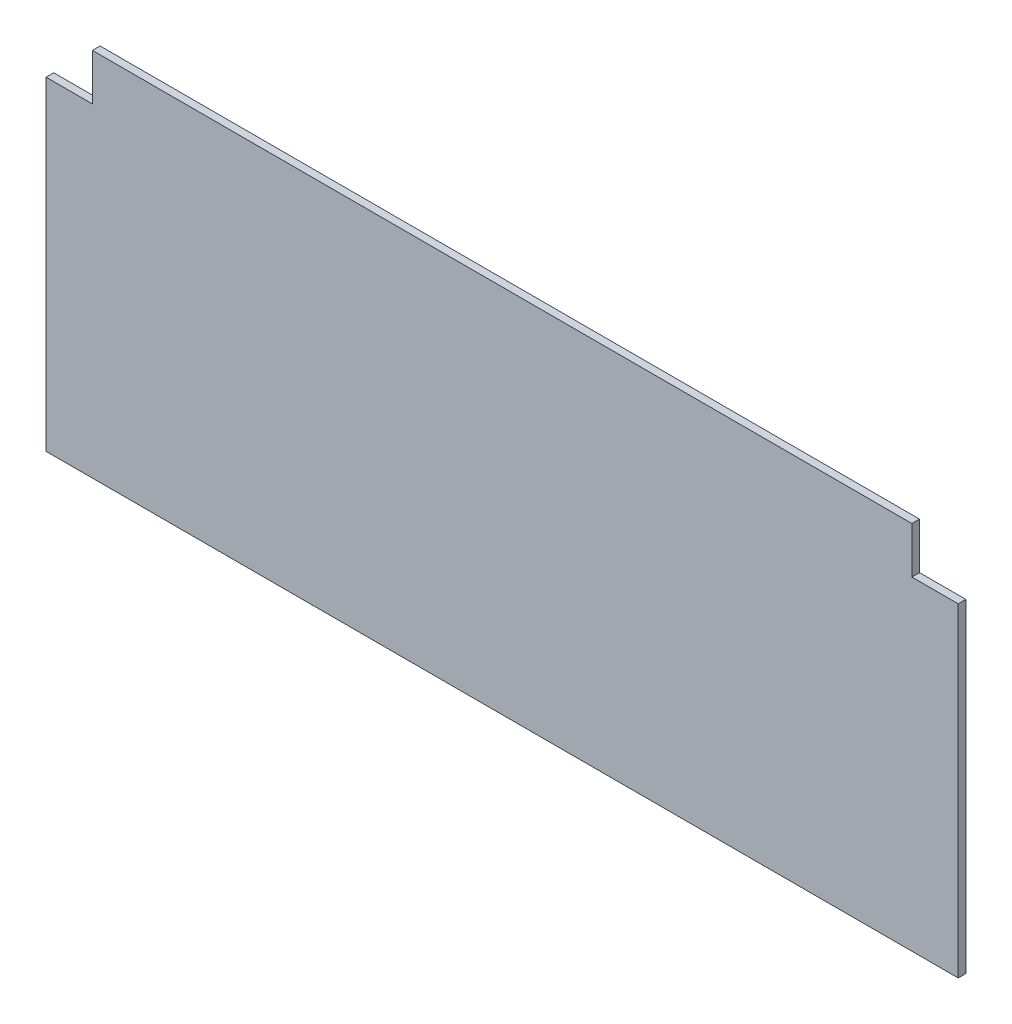
ISO-10303-21;
HEADER;
FILE_DESCRIPTION(('STEP AP214'),'2;1');
FILE_NAME('part.step','',(''),(''),'','','');
FILE_SCHEMA(('AUTOMOTIVE_DESIGN { 1 0 10303 214 1 1 1 1 }'));
ENDSEC;
DATA;
#1=APPLICATION_CONTEXT('core data for automotive mechanical design processes');
#2=APPLICATION_PROTOCOL_DEFINITION('international standard','automotive_design',2000,#1);
#3=PRODUCT_CONTEXT('',#1,'mechanical');
#4=PRODUCT('Part','Part','',(#3));
#5=PRODUCT_RELATED_PRODUCT_CATEGORY('part','',(#4));
#6=PRODUCT_DEFINITION_FORMATION('','',#4);
#7=PRODUCT_DEFINITION_CONTEXT('part definition',#1,'design');
#8=PRODUCT_DEFINITION('design','',#6,#7);
#9=PRODUCT_DEFINITION_SHAPE('','',#8);
#10=(LENGTH_UNIT() NAMED_UNIT(*) SI_UNIT(.MILLI.,.METRE.));
#11=(NAMED_UNIT(*) PLANE_ANGLE_UNIT() SI_UNIT($,.RADIAN.));
#12=(NAMED_UNIT(*) SI_UNIT($,.STERADIAN.) SOLID_ANGLE_UNIT());
#13=UNCERTAINTY_MEASURE_WITH_UNIT(LENGTH_MEASURE(1.E-05),#10,'distance_accuracy_value','');
#14=(GEOMETRIC_REPRESENTATION_CONTEXT(3) GLOBAL_UNCERTAINTY_ASSIGNED_CONTEXT((#13)) GLOBAL_UNIT_ASSIGNED_CONTEXT((#10,
#11,#12)) REPRESENTATION_CONTEXT('',''));
#15=CARTESIAN_POINT('',(0.,0.,0.));
#16=DIRECTION('',(0.,0.,1.));
#17=DIRECTION('',(1.,0.,0.));
#18=AXIS2_PLACEMENT_3D('',#15,#16,#17);
#19=CARTESIAN_POINT('',(0.,-39.8042937465679,-3.3));
#20=DIRECTION('',(0.,-1.,0.));
#21=DIRECTION('',(0.,0.,-1.));
#22=AXIS2_PLACEMENT_3D('',#19,#20,#21);
#23=PLANE('',#22);
#24=DIRECTION('',(1.,0.,0.));
#25=VECTOR('',#24,1.);
#26=CARTESIAN_POINT('',(0.,-39.8042937465679,0.));
#27=LINE('',#26,#25);
#28=CARTESIAN_POINT('',(0.,-39.8042937465679,0.));
#29=VERTEX_POINT('',#28);
#30=CARTESIAN_POINT('',(20.,-39.8042937465679,0.));
#31=VERTEX_POINT('',#30);
#32=EDGE_CURVE('E134',#29,#31,#27,.T.);
#33=ORIENTED_EDGE('',*,*,#32,.T.);
#34=DIRECTION('',(0.,0.,1.));
#35=VECTOR('',#34,1.);
#36=CARTESIAN_POINT('',(20.,-39.8042937465679,-3.3));
#37=LINE('',#36,#35);
#38=CARTESIAN_POINT('',(20.,-39.8042937465679,-3.3));
#39=VERTEX_POINT('',#38);
#40=EDGE_CURVE('E11',#39,#31,#37,.T.);
#41=ORIENTED_EDGE('',*,*,#40,.F.);
#42=DIRECTION('',(1.,0.,0.));
#43=VECTOR('',#42,1.);
#44=CARTESIAN_POINT('',(0.,-39.8042937465679,-3.3));
#45=LINE('',#44,#43);
#46=CARTESIAN_POINT('',(0.,-39.8042937465679,-3.3));
#47=VERTEX_POINT('',#46);
#48=EDGE_CURVE('E152',#47,#39,#45,.T.);
#49=ORIENTED_EDGE('',*,*,#48,.F.);
#50=DIRECTION('',(0.,0.,1.));
#51=VECTOR('',#50,1.);
#52=CARTESIAN_POINT('',(0.,-39.8042937465679,-3.3));
#53=LINE('',#52,#51);
#54=EDGE_CURVE('E40',#47,#29,#53,.T.);
#55=ORIENTED_EDGE('',*,*,#54,.T.);
#56=EDGE_LOOP('',(#33,#41,#49,#55));
#57=FACE_BOUND('',#56,.T.);
#58=ADVANCED_FACE('F37',(#57),#23,.F.);
#59=CARTESIAN_POINT('',(20.,0.,-3.3));
#60=DIRECTION('',(1.,0.,0.));
#61=DIRECTION('',(0.,1.,0.));
#62=AXIS2_PLACEMENT_3D('',#59,#60,#61);
#63=PLANE('',#62);
#64=DIRECTION('',(0.,1.,0.));
#65=VECTOR('',#64,1.);
#66=CARTESIAN_POINT('',(20.,0.,0.));
#67=LINE('',#66,#65);
#68=CARTESIAN_POINT('',(20.,-19.8042937465678,0.));
#69=VERTEX_POINT('',#68);
#70=EDGE_CURVE('E88',#31,#69,#67,.T.);
#71=ORIENTED_EDGE('',*,*,#70,.T.);
#72=DIRECTION('',(0.,0.,1.));
#73=VECTOR('',#72,1.);
#74=CARTESIAN_POINT('',(20.,-19.8042937465678,-3.3));
#75=LINE('',#74,#73);
#76=CARTESIAN_POINT('',(20.,-19.8042937465678,-3.3));
#77=VERTEX_POINT('',#76);
#78=EDGE_CURVE('E46',#77,#69,#75,.T.);
#79=ORIENTED_EDGE('',*,*,#78,.F.);
#80=DIRECTION('',(0.,1.,0.));
#81=VECTOR('',#80,1.);
#82=CARTESIAN_POINT('',(20.,0.,-3.3));
#83=LINE('',#82,#81);
#84=EDGE_CURVE('E54',#39,#77,#83,.T.);
#85=ORIENTED_EDGE('',*,*,#84,.F.);
#86=ORIENTED_EDGE('',*,*,#40,.T.);
#87=EDGE_LOOP('',(#71,#79,#85,#86));
#88=FACE_BOUND('',#87,.T.);
#89=ADVANCED_FACE('F177',(#88),#63,.F.);
#90=CARTESIAN_POINT('',(0.,-19.8042937465678,-3.3));
#91=DIRECTION('',(0.,1.,0.));
#92=DIRECTION('',(-1.,0.,0.));
#93=AXIS2_PLACEMENT_3D('',#90,#91,#92);
#94=PLANE('',#93);
#95=DIRECTION('',(-1.,0.,0.));
#96=VECTOR('',#95,1.);
#97=CARTESIAN_POINT('',(0.,-19.8042937465678,0.));
#98=LINE('',#97,#96);
#99=CARTESIAN_POINT('',(373.4,-19.8042937465678,0.));
#100=VERTEX_POINT('',#99);
#101=EDGE_CURVE('E112',#100,#69,#98,.T.);
#102=ORIENTED_EDGE('',*,*,#101,.F.);
#103=DIRECTION('',(0.,0.,1.));
#104=VECTOR('',#103,1.);
#105=CARTESIAN_POINT('',(373.4,-19.8042937465678,-3.3));
#106=LINE('',#105,#104);
#107=CARTESIAN_POINT('',(373.4,-19.8042937465678,-3.3));
#108=VERTEX_POINT('',#107);
#109=EDGE_CURVE('E108',#108,#100,#106,.T.);
#110=ORIENTED_EDGE('',*,*,#109,.F.);
#111=DIRECTION('',(-1.,0.,0.));
#112=VECTOR('',#111,1.);
#113=CARTESIAN_POINT('',(0.,-19.8042937465678,-3.3));
#114=LINE('',#113,#112);
#115=EDGE_CURVE('E111',#108,#77,#114,.T.);
#116=ORIENTED_EDGE('',*,*,#115,.T.);
#117=ORIENTED_EDGE('',*,*,#78,.T.);
#118=EDGE_LOOP('',(#102,#110,#116,#117));
#119=FACE_BOUND('',#118,.T.);
#120=ADVANCED_FACE('F110',(#119),#94,.T.);
#121=CARTESIAN_POINT('',(373.4,0.,-3.3));
#122=DIRECTION('',(1.,0.,0.));
#123=DIRECTION('',(0.,0.,-1.));
#124=AXIS2_PLACEMENT_3D('',#121,#122,#123);
#125=PLANE('',#124);
#126=DIRECTION('',(0.,1.,0.));
#127=VECTOR('',#126,1.);
#128=CARTESIAN_POINT('',(373.4,0.,0.));
#129=LINE('',#128,#127);
#130=CARTESIAN_POINT('',(373.4,-39.8042937465679,0.));
#131=VERTEX_POINT('',#130);
#132=EDGE_CURVE('E149',#131,#100,#129,.T.);
#133=ORIENTED_EDGE('',*,*,#132,.F.);
#134=DIRECTION('',(0.,0.,1.));
#135=VECTOR('',#134,1.);
#136=CARTESIAN_POINT('',(373.4,-39.8042937465679,-3.3));
#137=LINE('',#136,#135);
#138=CARTESIAN_POINT('',(373.4,-39.8042937465679,-3.3));
#139=VERTEX_POINT('',#138);
#140=EDGE_CURVE('E117',#139,#131,#137,.T.);
#141=ORIENTED_EDGE('',*,*,#140,.F.);
#142=DIRECTION('',(0.,1.,0.));
#143=VECTOR('',#142,1.);
#144=CARTESIAN_POINT('',(373.4,0.,-3.3));
#145=LINE('',#144,#143);
#146=EDGE_CURVE('E123',#139,#108,#145,.T.);
#147=ORIENTED_EDGE('',*,*,#146,.T.);
#148=ORIENTED_EDGE('',*,*,#109,.T.);
#149=EDGE_LOOP('',(#133,#141,#147,#148));
#150=FACE_BOUND('',#149,.T.);
#151=ADVANCED_FACE('F126',(#150),#125,.T.);
#152=CARTESIAN_POINT('',(0.,-39.8042937465679,-3.3));
#153=DIRECTION('',(0.,1.,0.));
#154=DIRECTION('',(0.,0.,1.));
#155=AXIS2_PLACEMENT_3D('',#152,#153,#154);
#156=PLANE('',#155);
#157=DIRECTION('',(-1.,0.,0.));
#158=VECTOR('',#157,1.);
#159=CARTESIAN_POINT('',(0.,-39.8042937465679,0.));
#160=LINE('',#159,#158);
#161=CARTESIAN_POINT('',(393.4,-39.8042937465679,0.));
#162=VERTEX_POINT('',#161);
#163=EDGE_CURVE('E146',#162,#131,#160,.T.);
#164=ORIENTED_EDGE('',*,*,#163,.F.);
#165=DIRECTION('',(0.,0.,1.));
#166=VECTOR('',#165,1.);
#167=CARTESIAN_POINT('',(393.4,-39.8042937465679,-3.3));
#168=LINE('',#167,#166);
#169=CARTESIAN_POINT('',(393.4,-39.8042937465679,-3.3));
#170=VERTEX_POINT('',#169);
#171=EDGE_CURVE('E156',#170,#162,#168,.T.);
#172=ORIENTED_EDGE('',*,*,#171,.F.);
#173=DIRECTION('',(-1.,0.,0.));
#174=VECTOR('',#173,1.);
#175=CARTESIAN_POINT('',(0.,-39.8042937465679,-3.3));
#176=LINE('',#175,#174);
#177=EDGE_CURVE('E127',#170,#139,#176,.T.);
#178=ORIENTED_EDGE('',*,*,#177,.T.);
#179=ORIENTED_EDGE('',*,*,#140,.T.);
#180=EDGE_LOOP('',(#164,#172,#178,#179));
#181=FACE_BOUND('',#180,.T.);
#182=ADVANCED_FACE('F190',(#181),#156,.T.);
#183=CARTESIAN_POINT('',(393.4,-1.56244946115617E-13,-3.3));
#184=DIRECTION('',(1.,0.,0.));
#185=DIRECTION('',(0.,1.,0.));
#186=AXIS2_PLACEMENT_3D('',#183,#184,#185);
#187=PLANE('',#186);
#188=DIRECTION('',(0.,1.,0.));
#189=VECTOR('',#188,1.);
#190=CARTESIAN_POINT('',(393.4,-1.56244946115617E-13,0.));
#191=LINE('',#190,#189);
#192=CARTESIAN_POINT('',(393.4,-179.572570655936,0.));
#193=VERTEX_POINT('',#192);
#194=EDGE_CURVE('E143',#193,#162,#191,.T.);
#195=ORIENTED_EDGE('',*,*,#194,.F.);
#196=DIRECTION('',(0.,0.,1.));
#197=VECTOR('',#196,1.);
#198=CARTESIAN_POINT('',(393.4,-179.572570655936,-3.3));
#199=LINE('',#198,#197);
#200=CARTESIAN_POINT('',(393.4,-179.572570655936,-3.3));
#201=VERTEX_POINT('',#200);
#202=EDGE_CURVE('E158',#201,#193,#199,.T.);
#203=ORIENTED_EDGE('',*,*,#202,.F.);
#204=DIRECTION('',(0.,1.,0.));
#205=VECTOR('',#204,1.);
#206=CARTESIAN_POINT('',(393.4,-1.56244946115617E-13,-3.3));
#207=LINE('',#206,#205);
#208=EDGE_CURVE('E129',#201,#170,#207,.T.);
#209=ORIENTED_EDGE('',*,*,#208,.T.);
#210=ORIENTED_EDGE('',*,*,#171,.T.);
#211=EDGE_LOOP('',(#195,#203,#209,#210));
#212=FACE_BOUND('',#211,.T.);
#213=ADVANCED_FACE('F173',(#212),#187,.T.);
#214=CARTESIAN_POINT('',(0.,-179.572570655936,-3.3));
#215=DIRECTION('',(0.,-1.,0.));
#216=DIRECTION('',(0.,0.,-1.));
#217=AXIS2_PLACEMENT_3D('',#214,#215,#216);
#218=PLANE('',#217);
#219=DIRECTION('',(1.,0.,0.));
#220=VECTOR('',#219,1.);
#221=CARTESIAN_POINT('',(0.,-179.572570655936,0.));
#222=LINE('',#221,#220);
#223=CARTESIAN_POINT('',(-1.54080069498988E-13,-179.572570655936,0.));
#224=VERTEX_POINT('',#223);
#225=EDGE_CURVE('E140',#224,#193,#222,.T.);
#226=ORIENTED_EDGE('',*,*,#225,.F.);
#227=DIRECTION('',(0.,0.,1.));
#228=VECTOR('',#227,1.);
#229=CARTESIAN_POINT('',(-1.54080069498988E-13,-179.572570655936,-3.3));
#230=LINE('',#229,#228);
#231=CARTESIAN_POINT('',(-1.54080069498988E-13,-179.572570655936,-3.3));
#232=VERTEX_POINT('',#231);
#233=EDGE_CURVE('E159',#232,#224,#230,.T.);
#234=ORIENTED_EDGE('',*,*,#233,.F.);
#235=DIRECTION('',(1.,0.,0.));
#236=VECTOR('',#235,1.);
#237=CARTESIAN_POINT('',(0.,-179.572570655936,-3.3));
#238=LINE('',#237,#236);
#239=EDGE_CURVE('E204',#232,#201,#238,.T.);
#240=ORIENTED_EDGE('',*,*,#239,.T.);
#241=ORIENTED_EDGE('',*,*,#202,.T.);
#242=EDGE_LOOP('',(#226,#234,#240,#241));
#243=FACE_BOUND('',#242,.T.);
#244=ADVANCED_FACE('F167',(#243),#218,.T.);
#245=CARTESIAN_POINT('',(0.,0.,-3.3));
#246=DIRECTION('',(-1.,0.,0.));
#247=DIRECTION('',(0.,-1.,0.));
#248=AXIS2_PLACEMENT_3D('',#245,#246,#247);
#249=PLANE('',#248);
#250=DIRECTION('',(0.,-1.,0.));
#251=VECTOR('',#250,1.);
#252=CARTESIAN_POINT('',(0.,0.,0.));
#253=LINE('',#252,#251);
#254=EDGE_CURVE('E137',#29,#224,#253,.T.);
#255=ORIENTED_EDGE('',*,*,#254,.F.);
#256=ORIENTED_EDGE('',*,*,#54,.F.);
#257=DIRECTION('',(0.,-1.,0.));
#258=VECTOR('',#257,1.);
#259=CARTESIAN_POINT('',(0.,0.,-3.3));
#260=LINE('',#259,#258);
#261=EDGE_CURVE('E205',#47,#232,#260,.T.);
#262=ORIENTED_EDGE('',*,*,#261,.T.);
#263=ORIENTED_EDGE('',*,*,#233,.T.);
#264=EDGE_LOOP('',(#255,#256,#262,#263));
#265=FACE_BOUND('',#264,.T.);
#266=ADVANCED_FACE('F165',(#265),#249,.T.);
#267=CARTESIAN_POINT('',(0.,0.,-3.3));
#268=DIRECTION('',(0.,0.,1.));
#269=DIRECTION('',(1.,0.,0.));
#270=AXIS2_PLACEMENT_3D('',#267,#268,#269);
#271=PLANE('',#270);
#272=ORIENTED_EDGE('',*,*,#48,.T.);
#273=ORIENTED_EDGE('',*,*,#84,.T.);
#274=ORIENTED_EDGE('',*,*,#115,.F.);
#275=ORIENTED_EDGE('',*,*,#146,.F.);
#276=ORIENTED_EDGE('',*,*,#177,.F.);
#277=ORIENTED_EDGE('',*,*,#208,.F.);
#278=ORIENTED_EDGE('',*,*,#239,.F.);
#279=ORIENTED_EDGE('',*,*,#261,.F.);
#280=EDGE_LOOP('',(#272,#273,#274,#275,#276,#277,#278,#279));
#281=FACE_BOUND('',#280,.T.);
#282=ADVANCED_FACE('F121',(#281),#271,.F.);
#283=CARTESIAN_POINT('',(0.,0.,0.));
#284=DIRECTION('',(0.,0.,1.));
#285=DIRECTION('',(1.,0.,0.));
#286=AXIS2_PLACEMENT_3D('',#283,#284,#285);
#287=PLANE('',#286);
#288=ORIENTED_EDGE('',*,*,#32,.F.);
#289=ORIENTED_EDGE('',*,*,#254,.T.);
#290=ORIENTED_EDGE('',*,*,#225,.T.);
#291=ORIENTED_EDGE('',*,*,#194,.T.);
#292=ORIENTED_EDGE('',*,*,#163,.T.);
#293=ORIENTED_EDGE('',*,*,#132,.T.);
#294=ORIENTED_EDGE('',*,*,#101,.T.);
#295=ORIENTED_EDGE('',*,*,#70,.F.);
#296=EDGE_LOOP('',(#288,#289,#290,#291,#292,#293,#294,#295));
#297=FACE_BOUND('',#296,.T.);
#298=ADVANCED_FACE('F164',(#297),#287,.T.);
#299=CLOSED_SHELL('',(#58,#89,#120,#151,#182,#213,#244,#266,#282,#298));
#300=MANIFOLD_SOLID_BREP('B2',#299);
#301=ADVANCED_BREP_SHAPE_REPRESENTATION('',(#18,#300),#14);
#302=SHAPE_DEFINITION_REPRESENTATION(#9,#301);
ENDSEC;
END-ISO-10303-21;
